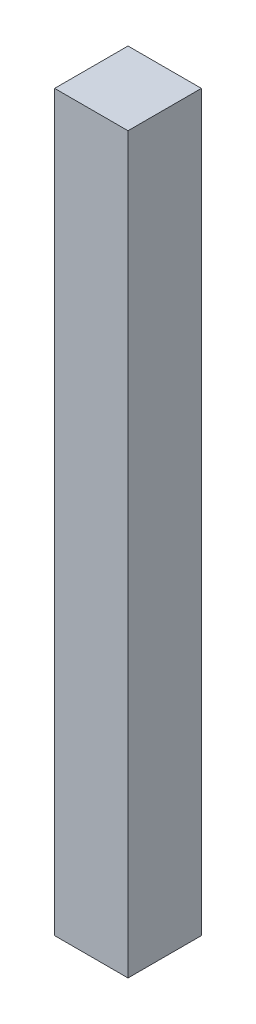
ISO-10303-21;
HEADER;
FILE_DESCRIPTION(('STEP AP214'),'2;1');
FILE_NAME('part.step','',(''),(''),'','','');
FILE_SCHEMA(('AUTOMOTIVE_DESIGN { 1 0 10303 214 1 1 1 1 }'));
ENDSEC;
DATA;
#1=APPLICATION_CONTEXT('core data for automotive mechanical design processes');
#2=APPLICATION_PROTOCOL_DEFINITION('international standard','automotive_design',2000,#1);
#3=PRODUCT_CONTEXT('',#1,'mechanical');
#4=PRODUCT('Part','Part','',(#3));
#5=PRODUCT_RELATED_PRODUCT_CATEGORY('part','',(#4));
#6=PRODUCT_DEFINITION_FORMATION('','',#4);
#7=PRODUCT_DEFINITION_CONTEXT('part definition',#1,'design');
#8=PRODUCT_DEFINITION('design','',#6,#7);
#9=PRODUCT_DEFINITION_SHAPE('','',#8);
#10=(LENGTH_UNIT() NAMED_UNIT(*) SI_UNIT(.MILLI.,.METRE.));
#11=(NAMED_UNIT(*) PLANE_ANGLE_UNIT() SI_UNIT($,.RADIAN.));
#12=(NAMED_UNIT(*) SI_UNIT($,.STERADIAN.) SOLID_ANGLE_UNIT());
#13=UNCERTAINTY_MEASURE_WITH_UNIT(LENGTH_MEASURE(1.E-05),#10,'distance_accuracy_value','');
#14=(GEOMETRIC_REPRESENTATION_CONTEXT(3) GLOBAL_UNCERTAINTY_ASSIGNED_CONTEXT((#13)) GLOBAL_UNIT_ASSIGNED_CONTEXT((#10,
#11,#12)) REPRESENTATION_CONTEXT('',''));
#15=CARTESIAN_POINT('',(0.,0.,0.));
#16=DIRECTION('',(0.,0.,1.));
#17=DIRECTION('',(1.,0.,0.));
#18=AXIS2_PLACEMENT_3D('',#15,#16,#17);
#19=CARTESIAN_POINT('',(0.,200.,0.));
#20=DIRECTION('',(1.,0.,0.));
#21=DIRECTION('',(0.,0.,-1.));
#22=AXIS2_PLACEMENT_3D('',#19,#20,#21);
#23=PLANE('',#22);
#24=DIRECTION('',(0.,0.,1.));
#25=VECTOR('',#24,1.);
#26=CARTESIAN_POINT('',(0.,0.,0.));
#27=LINE('',#26,#25);
#28=CARTESIAN_POINT('',(0.,0.,0.));
#29=VERTEX_POINT('',#28);
#30=CARTESIAN_POINT('',(0.,0.,20.));
#31=VERTEX_POINT('',#30);
#32=EDGE_CURVE('E95',#29,#31,#27,.T.);
#33=ORIENTED_EDGE('',*,*,#32,.T.);
#34=DIRECTION('',(0.,-1.,0.));
#35=VECTOR('',#34,1.);
#36=CARTESIAN_POINT('',(0.,200.,20.));
#37=LINE('',#36,#35);
#38=CARTESIAN_POINT('',(0.,200.,20.));
#39=VERTEX_POINT('',#38);
#40=EDGE_CURVE('E11',#39,#31,#37,.T.);
#41=ORIENTED_EDGE('',*,*,#40,.F.);
#42=DIRECTION('',(0.,0.,1.));
#43=VECTOR('',#42,1.);
#44=CARTESIAN_POINT('',(0.,200.,0.));
#45=LINE('',#44,#43);
#46=CARTESIAN_POINT('',(0.,200.,0.));
#47=VERTEX_POINT('',#46);
#48=EDGE_CURVE('E83',#47,#39,#45,.T.);
#49=ORIENTED_EDGE('',*,*,#48,.F.);
#50=DIRECTION('',(0.,-1.,0.));
#51=VECTOR('',#50,1.);
#52=CARTESIAN_POINT('',(0.,200.,0.));
#53=LINE('',#52,#51);
#54=EDGE_CURVE('E91',#47,#29,#53,.T.);
#55=ORIENTED_EDGE('',*,*,#54,.T.);
#56=EDGE_LOOP('',(#33,#41,#49,#55));
#57=FACE_BOUND('',#56,.T.);
#58=ADVANCED_FACE('F32',(#57),#23,.F.);
#59=CARTESIAN_POINT('',(0.,200.,20.));
#60=DIRECTION('',(0.,0.,-1.));
#61=DIRECTION('',(-1.,0.,0.));
#62=AXIS2_PLACEMENT_3D('',#59,#60,#61);
#63=PLANE('',#62);
#64=DIRECTION('',(1.,0.,0.));
#65=VECTOR('',#64,1.);
#66=CARTESIAN_POINT('',(0.,0.,20.));
#67=LINE('',#66,#65);
#68=CARTESIAN_POINT('',(20.,0.,20.));
#69=VERTEX_POINT('',#68);
#70=EDGE_CURVE('E87',#31,#69,#67,.T.);
#71=ORIENTED_EDGE('',*,*,#70,.T.);
#72=DIRECTION('',(0.,-1.,0.));
#73=VECTOR('',#72,1.);
#74=CARTESIAN_POINT('',(20.,200.,20.));
#75=LINE('',#74,#73);
#76=CARTESIAN_POINT('',(20.,200.,20.));
#77=VERTEX_POINT('',#76);
#78=EDGE_CURVE('E40',#77,#69,#75,.T.);
#79=ORIENTED_EDGE('',*,*,#78,.F.);
#80=DIRECTION('',(1.,0.,0.));
#81=VECTOR('',#80,1.);
#82=CARTESIAN_POINT('',(0.,200.,20.));
#83=LINE('',#82,#81);
#84=EDGE_CURVE('E78',#39,#77,#83,.T.);
#85=ORIENTED_EDGE('',*,*,#84,.F.);
#86=ORIENTED_EDGE('',*,*,#40,.T.);
#87=EDGE_LOOP('',(#71,#79,#85,#86));
#88=FACE_BOUND('',#87,.T.);
#89=ADVANCED_FACE('F86',(#88),#63,.F.);
#90=CARTESIAN_POINT('',(20.,200.,0.));
#91=DIRECTION('',(-1.,0.,0.));
#92=DIRECTION('',(0.,0.,1.));
#93=AXIS2_PLACEMENT_3D('',#90,#91,#92);
#94=PLANE('',#93);
#95=DIRECTION('',(0.,0.,-1.));
#96=VECTOR('',#95,1.);
#97=CARTESIAN_POINT('',(20.,0.,0.));
#98=LINE('',#97,#96);
#99=CARTESIAN_POINT('',(20.,0.,0.));
#100=VERTEX_POINT('',#99);
#101=EDGE_CURVE('E65',#69,#100,#98,.T.);
#102=ORIENTED_EDGE('',*,*,#101,.T.);
#103=DIRECTION('',(0.,-1.,0.));
#104=VECTOR('',#103,1.);
#105=CARTESIAN_POINT('',(20.,200.,0.));
#106=LINE('',#105,#104);
#107=CARTESIAN_POINT('',(20.,200.,0.));
#108=VERTEX_POINT('',#107);
#109=EDGE_CURVE('E88',#108,#100,#106,.T.);
#110=ORIENTED_EDGE('',*,*,#109,.F.);
#111=DIRECTION('',(0.,0.,-1.));
#112=VECTOR('',#111,1.);
#113=CARTESIAN_POINT('',(20.,200.,0.));
#114=LINE('',#113,#112);
#115=EDGE_CURVE('E81',#77,#108,#114,.T.);
#116=ORIENTED_EDGE('',*,*,#115,.F.);
#117=ORIENTED_EDGE('',*,*,#78,.T.);
#118=EDGE_LOOP('',(#102,#110,#116,#117));
#119=FACE_BOUND('',#118,.T.);
#120=ADVANCED_FACE('F89',(#119),#94,.F.);
#121=CARTESIAN_POINT('',(0.,200.,0.));
#122=DIRECTION('',(0.,0.,1.));
#123=DIRECTION('',(1.,0.,0.));
#124=AXIS2_PLACEMENT_3D('',#121,#122,#123);
#125=PLANE('',#124);
#126=DIRECTION('',(-1.,0.,0.));
#127=VECTOR('',#126,1.);
#128=CARTESIAN_POINT('',(0.,0.,0.));
#129=LINE('',#128,#127);
#130=EDGE_CURVE('E71',#100,#29,#129,.T.);
#131=ORIENTED_EDGE('',*,*,#130,.T.);
#132=ORIENTED_EDGE('',*,*,#54,.F.);
#133=DIRECTION('',(-1.,0.,0.));
#134=VECTOR('',#133,1.);
#135=CARTESIAN_POINT('',(0.,200.,0.));
#136=LINE('',#135,#134);
#137=EDGE_CURVE('E48',#108,#47,#136,.T.);
#138=ORIENTED_EDGE('',*,*,#137,.F.);
#139=ORIENTED_EDGE('',*,*,#109,.T.);
#140=EDGE_LOOP('',(#131,#132,#138,#139));
#141=FACE_BOUND('',#140,.T.);
#142=ADVANCED_FACE('F102',(#141),#125,.F.);
#143=CARTESIAN_POINT('',(0.,200.,0.));
#144=DIRECTION('',(0.,1.,0.));
#145=DIRECTION('',(0.,0.,1.));
#146=AXIS2_PLACEMENT_3D('',#143,#144,#145);
#147=PLANE('',#146);
#148=ORIENTED_EDGE('',*,*,#48,.T.);
#149=ORIENTED_EDGE('',*,*,#84,.T.);
#150=ORIENTED_EDGE('',*,*,#115,.T.);
#151=ORIENTED_EDGE('',*,*,#137,.T.);
#152=EDGE_LOOP('',(#148,#149,#150,#151));
#153=FACE_BOUND('',#152,.T.);
#154=ADVANCED_FACE('F79',(#153),#147,.T.);
#155=CARTESIAN_POINT('',(0.,0.,0.));
#156=DIRECTION('',(0.,1.,0.));
#157=DIRECTION('',(0.,0.,1.));
#158=AXIS2_PLACEMENT_3D('',#155,#156,#157);
#159=PLANE('',#158);
#160=ORIENTED_EDGE('',*,*,#32,.F.);
#161=ORIENTED_EDGE('',*,*,#130,.F.);
#162=ORIENTED_EDGE('',*,*,#101,.F.);
#163=ORIENTED_EDGE('',*,*,#70,.F.);
#164=EDGE_LOOP('',(#160,#161,#162,#163));
#165=FACE_BOUND('',#164,.T.);
#166=ADVANCED_FACE('F105',(#165),#159,.F.);
#167=CLOSED_SHELL('',(#58,#89,#120,#142,#154,#166));
#168=MANIFOLD_SOLID_BREP('B2',#167);
#169=ADVANCED_BREP_SHAPE_REPRESENTATION('',(#18,#168),#14);
#170=SHAPE_DEFINITION_REPRESENTATION(#9,#169);
ENDSEC;
END-ISO-10303-21;
